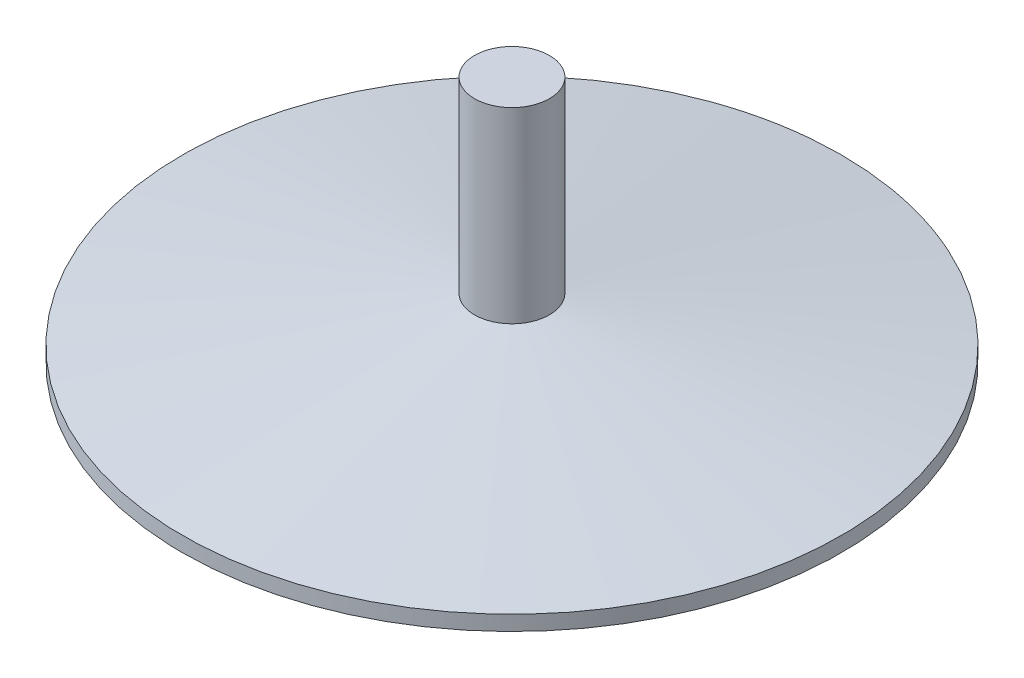
ISO-10303-21;
HEADER;
FILE_DESCRIPTION(('STEP AP214'),'2;1');
FILE_NAME('part.step','',(''),(''),'','','');
FILE_SCHEMA(('AUTOMOTIVE_DESIGN { 1 0 10303 214 1 1 1 1 }'));
ENDSEC;
DATA;
#1=APPLICATION_CONTEXT('core data for automotive mechanical design processes');
#2=APPLICATION_PROTOCOL_DEFINITION('international standard','automotive_design',2000,#1);
#3=PRODUCT_CONTEXT('',#1,'mechanical');
#4=PRODUCT('Part','Part','',(#3));
#5=PRODUCT_RELATED_PRODUCT_CATEGORY('part','',(#4));
#6=PRODUCT_DEFINITION_FORMATION('','',#4);
#7=PRODUCT_DEFINITION_CONTEXT('part definition',#1,'design');
#8=PRODUCT_DEFINITION('design','',#6,#7);
#9=PRODUCT_DEFINITION_SHAPE('','',#8);
#10=(LENGTH_UNIT() NAMED_UNIT(*) SI_UNIT(.MILLI.,.METRE.));
#11=(NAMED_UNIT(*) PLANE_ANGLE_UNIT() SI_UNIT($,.RADIAN.));
#12=(NAMED_UNIT(*) SI_UNIT($,.STERADIAN.) SOLID_ANGLE_UNIT());
#13=UNCERTAINTY_MEASURE_WITH_UNIT(LENGTH_MEASURE(1.E-05),#10,'distance_accuracy_value','');
#14=(GEOMETRIC_REPRESENTATION_CONTEXT(3) GLOBAL_UNCERTAINTY_ASSIGNED_CONTEXT((#13)) GLOBAL_UNIT_ASSIGNED_CONTEXT((#10,
#11,#12)) REPRESENTATION_CONTEXT('',''));
#15=CARTESIAN_POINT('',(0.,0.,0.));
#16=DIRECTION('',(0.,0.,1.));
#17=DIRECTION('',(1.,0.,0.));
#18=AXIS2_PLACEMENT_3D('',#15,#16,#17);
#19=CARTESIAN_POINT('',(0.,200.,0.));
#20=DIRECTION('',(0.,-1.,0.));
#21=DIRECTION('',(0.,0.,-1.));
#22=AXIS2_PLACEMENT_3D('',#19,#20,#21);
#23=CYLINDRICAL_SURFACE('',#22,4400.);
#24=CARTESIAN_POINT('',(0.,200.,0.));
#25=DIRECTION('',(0.,-1.,0.));
#26=DIRECTION('',(0.,0.,-1.));
#27=AXIS2_PLACEMENT_3D('',#24,#25,#26);
#28=CIRCLE('',#27,4400.);
#29=CARTESIAN_POINT('',(-171.361945774304,200.,4396.66181136785));
#30=VERTEX_POINT('',#29);
#31=EDGE_CURVE('E11',#30,#30,#28,.F.);
#32=ORIENTED_EDGE('',*,*,#31,.F.);
#33=EDGE_LOOP('',(#32));
#34=FACE_BOUND('',#33,.T.);
#35=CARTESIAN_POINT('',(0.,0.,0.));
#36=DIRECTION('',(0.,1.,0.));
#37=DIRECTION('',(0.,0.,1.));
#38=AXIS2_PLACEMENT_3D('',#35,#36,#37);
#39=CIRCLE('',#38,4400.);
#40=CARTESIAN_POINT('',(0.,0.,4400.));
#41=VERTEX_POINT('',#40);
#42=EDGE_CURVE('E45',#41,#41,#39,.T.);
#43=ORIENTED_EDGE('',*,*,#42,.T.);
#44=EDGE_LOOP('',(#43));
#45=FACE_BOUND('',#44,.T.);
#46=ADVANCED_FACE('F38',(#34,#45),#23,.T.);
#47=CARTESIAN_POINT('',(0.,0.,0.));
#48=DIRECTION('',(0.,1.,0.));
#49=DIRECTION('',(0.,0.,1.));
#50=AXIS2_PLACEMENT_3D('',#47,#48,#49);
#51=PLANE('',#50);
#52=ORIENTED_EDGE('',*,*,#42,.F.);
#53=EDGE_LOOP('',(#52));
#54=FACE_BOUND('',#53,.T.);
#55=ADVANCED_FACE('F68',(#54),#51,.F.);
#56=CARTESIAN_POINT('',(-171.361945774304,200.,4396.66181136785));
#57=CARTESIAN_POINT('',(143.713693887058,800.,478.901215481165));
#58=CARTESIAN_POINT('',(8621.9616769614,200.,4739.38570291646));
#59=CARTESIAN_POINT('',(1101.51612484939,800.,191.473827707048));
#60=CARTESIAN_POINT('',(8964.68556851001,200.,-4053.93791981925));
#61=CARTESIAN_POINT('',(814.088737075271,800.,-766.328603255281));
#62=CARTESIAN_POINT('',(171.361945774304,200.,-4396.66181136785));
#63=CARTESIAN_POINT('',(-143.713693887058,800.,-478.901215481165));
#64=CARTESIAN_POINT('',(-8621.9616769614,200.,-4739.38570291646));
#65=CARTESIAN_POINT('',(-1101.51612484939,800.,-191.473827707049));
#66=CARTESIAN_POINT('',(-8964.68556851001,200.,4053.93791981924));
#67=CARTESIAN_POINT('',(-814.088737075271,800.,766.328603255282));
#68=CARTESIAN_POINT('',(-171.361945774304,200.,4396.66181136785));
#69=CARTESIAN_POINT('',(143.713693887058,800.,478.901215481165));
#70=(BOUNDED_SURFACE() B_SPLINE_SURFACE(3,1,((#56,#57),(#58,#59),(#60,#61),(#62,#63),(#64,#65),
(#66,#67),(#68,#69)),.UNSPECIFIED.,.T.,.F.,.F.) B_SPLINE_SURFACE_WITH_KNOTS((4,3,4),(2,2),(0.,
0.5,1.),(0.,1.),.UNSPECIFIED.) GEOMETRIC_REPRESENTATION_ITEM() RATIONAL_B_SPLINE_SURFACE(((1.,
1.),(0.333333333333333,0.333333333333333),(0.333333333333333,0.333333333333333),(1.,1.),
(0.333333333333333,0.333333333333333),(0.333333333333333,0.333333333333333),(1.,1.))) REPRESENTATION_ITEM('') SURFACE());
#71=CARTESIAN_POINT('',(0.,800.,0.));
#72=DIRECTION('',(0.,1.,0.));
#73=DIRECTION('',(0.,0.,1.));
#74=AXIS2_PLACEMENT_3D('',#71,#72,#73);
#75=CIRCLE('',#74,500.);
#76=CARTESIAN_POINT('',(143.713693887058,800.,478.901215481165));
#77=VERTEX_POINT('',#76);
#78=EDGE_CURVE('E49',#77,#77,#75,.T.);
#79=CARTESIAN_POINT('',(-171.361945774304,200.,4396.66181136785));
#80=CARTESIAN_POINT('',(-168.079907861165,206.25,4355.8518051607));
#81=CARTESIAN_POINT('',(-164.797869948026,212.5,4315.04179895355));
#82=CARTESIAN_POINT('',(-158.233794121747,225.,4233.42178653924));
#83=CARTESIAN_POINT('',(-154.951756208608,231.25,4192.61178033209));
#84=CARTESIAN_POINT('',(-148.38768038233,243.75,4110.99176791778));
#85=CARTESIAN_POINT('',(-145.105642469191,250.,4070.18176171063));
#86=CARTESIAN_POINT('',(-138.541566642912,262.5,3988.56174929632));
#87=CARTESIAN_POINT('',(-135.259528729773,268.75,3947.75174308917));
#88=CARTESIAN_POINT('',(-128.695452903495,281.25,3866.13173067486));
#89=CARTESIAN_POINT('',(-125.413414990355,287.5,3825.32172446771));
#90=CARTESIAN_POINT('',(-118.849339164077,300.,3743.7017120534));
#91=CARTESIAN_POINT('',(-115.567301250938,306.25,3702.89170584625));
#92=CARTESIAN_POINT('',(-109.00322542466,318.75,3621.27169343195));
#93=CARTESIAN_POINT('',(-105.72118751152,325.,3580.46168722479));
#94=CARTESIAN_POINT('',(-99.157111685242,337.5,3498.84167481049));
#95=CARTESIAN_POINT('',(-95.8750737721028,343.75,3458.03166860333));
#96=CARTESIAN_POINT('',(-89.3109979458244,356.25,3376.41165618903));
#97=CARTESIAN_POINT('',(-86.0289600326852,362.5,3335.60164998188));
#98=CARTESIAN_POINT('',(-79.4648842064068,375.,3253.98163756757));
#99=CARTESIAN_POINT('',(-76.1828462932676,381.25,3213.17163136042));
#100=CARTESIAN_POINT('',(-69.6187704669892,393.75,3131.55161894611));
#101=CARTESIAN_POINT('',(-66.33673255385,400.,3090.74161273896));
#102=CARTESIAN_POINT('',(-59.7726567275717,412.5,3009.12160032465));
#103=CARTESIAN_POINT('',(-56.4906188144325,418.75,2968.3115941175));
#104=CARTESIAN_POINT('',(-49.9265429881541,431.25,2886.69158170319));
#105=CARTESIAN_POINT('',(-46.6445050750149,437.5,2845.88157549604));
#106=CARTESIAN_POINT('',(-40.0804292487365,450.,2764.26156308173));
#107=CARTESIAN_POINT('',(-36.7983913355973,456.25,2723.45155687458));
#108=CARTESIAN_POINT('',(-30.234315509319,468.75,2641.83154446027));
#109=CARTESIAN_POINT('',(-26.9522775961798,475.,2601.02153825312));
#110=CARTESIAN_POINT('',(-20.3882017699014,487.5,2519.40152583881));
#111=CARTESIAN_POINT('',(-17.1061638567622,493.75,2478.59151963166));
#112=CARTESIAN_POINT('',(-10.5420880304838,506.25,2396.97150721736));
#113=CARTESIAN_POINT('',(-7.26005011734461,512.5,2356.1615010102));
#114=CARTESIAN_POINT('',(-0.69597429106623,525.,2274.5414885959));
#115=CARTESIAN_POINT('',(2.58606362207296,531.25,2233.73148238874));
#116=CARTESIAN_POINT('',(9.15013944835134,543.75,2152.11146997444));
#117=CARTESIAN_POINT('',(12.4321773614905,550.,2111.30146376728));
#118=CARTESIAN_POINT('',(18.9962531877689,562.5,2029.68145135298));
#119=CARTESIAN_POINT('',(22.2782911009081,568.75,1988.87144514583));
#120=CARTESIAN_POINT('',(28.8423669271865,581.25,1907.25143273152));
#121=CARTESIAN_POINT('',(32.1244048403257,587.5,1866.44142652437));
#122=CARTESIAN_POINT('',(38.6884806666041,600.,1784.82141411006));
#123=CARTESIAN_POINT('',(41.9705185797432,606.25,1744.01140790291));
#124=CARTESIAN_POINT('',(48.5345944060216,618.75,1662.3913954886));
#125=CARTESIAN_POINT('',(51.8166323191608,625.,1621.58138928145));
#126=CARTESIAN_POINT('',(58.3807081454392,637.5,1539.96137686714));
#127=CARTESIAN_POINT('',(61.6627460585784,643.75,1499.15137065999));
#128=CARTESIAN_POINT('',(68.2268218848568,656.25,1417.53135824568));
#129=CARTESIAN_POINT('',(71.508859797996,662.5,1376.72135203853));
#130=CARTESIAN_POINT('',(78.0729356242744,675.,1295.10133962422));
#131=CARTESIAN_POINT('',(81.3549735374136,681.25,1254.29133341707));
#132=CARTESIAN_POINT('',(87.919049363692,693.75,1172.67132100277));
#133=CARTESIAN_POINT('',(91.2010872768311,700.,1131.86131479561));
#134=CARTESIAN_POINT('',(97.7651631031095,712.5,1050.24130238131));
#135=CARTESIAN_POINT('',(101.047201016249,718.75,1009.43129617415));
#136=CARTESIAN_POINT('',(107.611276842527,731.25,927.811283759848));
#137=CARTESIAN_POINT('',(110.893314755666,737.5,887.001277552695));
#138=CARTESIAN_POINT('',(117.457390581945,750.,805.381265138389));
#139=CARTESIAN_POINT('',(120.739428495084,756.25,764.571258931236));
#140=CARTESIAN_POINT('',(127.303504321362,768.75,682.95124651693));
#141=CARTESIAN_POINT('',(130.585542234501,775.,642.141240309777));
#142=CARTESIAN_POINT('',(137.14961806078,787.5,560.521227895471));
#143=CARTESIAN_POINT('',(140.431655973919,793.75,519.711221688318));
#144=CARTESIAN_POINT('',(143.713693887058,800.,478.901215481165));
#145=B_SPLINE_CURVE_WITH_KNOTS('',3,(#79,#80,#81,#82,#83,#84,#85,#86,#87,#88,#89,#90,#91,#92,
#93,#94,#95,#96,#97,#98,#99,#100,#101,#102,#103,#104,#105,#106,#107,#108,#109,#110,#111,#112,
#113,#114,#115,#116,#117,#118,#119,#120,#121,#122,#123,#124,#125,#126,#127,#128,#129,#130,#131,
#132,#133,#134,#135,#136,#137,#138,#139,#140,#141,#142,#143,#144),.UNSPECIFIED.,.F.,.F.,(4,2,2,
2,2,2,2,2,2,2,2,2,2,2,2,2,2,2,2,2,2,2,2,2,2,2,2,2,2,2,2,2,4),(0.,124.248210914365,
248.496421828729,372.744632743093,496.992843657457,621.241054571821,745.489265486186,
869.73747640055,993.985687314914,1118.23389822928,1242.48210914364,1366.73032005801,
1490.97853097237,1615.22674188673,1739.4749528011,1863.72316371546,1987.97137462983,
2112.21958554419,2236.46779645856,2360.71600737292,2484.96421828728,2609.21242920165,
2733.46064011601,2857.70885103038,2981.95706194474,3106.20527285911,3230.45348377347,
3354.70169468784,3478.9499056022,3603.19811651656,3727.44632743093,3851.69453834529,
3975.94274925966),.UNSPECIFIED.);
#146=EDGE_CURVE('BSEAM63',#30,#77,#145,.T.);
#147=ORIENTED_EDGE('',*,*,#31,.T.);
#148=ORIENTED_EDGE('',*,*,#78,.F.);
#149=ORIENTED_EDGE('',*,*,#146,.T.);
#150=ORIENTED_EDGE('',*,*,#146,.F.);
#151=EDGE_LOOP('',(#147,#149,#148,#150));
#152=FACE_BOUND('',#151,.T.);
#153=ADVANCED_FACE('F63',(#152),#70,.T.);
#154=CARTESIAN_POINT('',(0.,3300.,0.));
#155=DIRECTION('',(0.,-1.,0.));
#156=DIRECTION('',(0.,0.,-1.));
#157=AXIS2_PLACEMENT_3D('',#154,#155,#156);
#158=CYLINDRICAL_SURFACE('',#157,500.);
#159=CARTESIAN_POINT('',(0.,3300.,0.));
#160=DIRECTION('',(0.,1.,0.));
#161=DIRECTION('',(0.,0.,1.));
#162=AXIS2_PLACEMENT_3D('',#159,#160,#161);
#163=CIRCLE('',#162,500.);
#164=CARTESIAN_POINT('',(0.,3300.,500.));
#165=VERTEX_POINT('',#164);
#166=EDGE_CURVE('E54',#165,#165,#163,.T.);
#167=ORIENTED_EDGE('',*,*,#166,.F.);
#168=EDGE_LOOP('',(#167));
#169=FACE_BOUND('',#168,.T.);
#170=ORIENTED_EDGE('',*,*,#78,.T.);
#171=EDGE_LOOP('',(#170));
#172=FACE_BOUND('',#171,.T.);
#173=ADVANCED_FACE('F60',(#169,#172),#158,.T.);
#174=CARTESIAN_POINT('',(0.,3300.,0.));
#175=DIRECTION('',(0.,1.,0.));
#176=DIRECTION('',(0.,0.,1.));
#177=AXIS2_PLACEMENT_3D('',#174,#175,#176);
#178=PLANE('',#177);
#179=ORIENTED_EDGE('',*,*,#166,.T.);
#180=EDGE_LOOP('',(#179));
#181=FACE_BOUND('',#180,.T.);
#182=ADVANCED_FACE('F58',(#181),#178,.T.);
#183=CLOSED_SHELL('',(#46,#55,#153,#173,#182));
#184=MANIFOLD_SOLID_BREP('B2',#183);
#185=ADVANCED_BREP_SHAPE_REPRESENTATION('',(#18,#184),#14);
#186=SHAPE_DEFINITION_REPRESENTATION(#9,#185);
ENDSEC;
END-ISO-10303-21;
